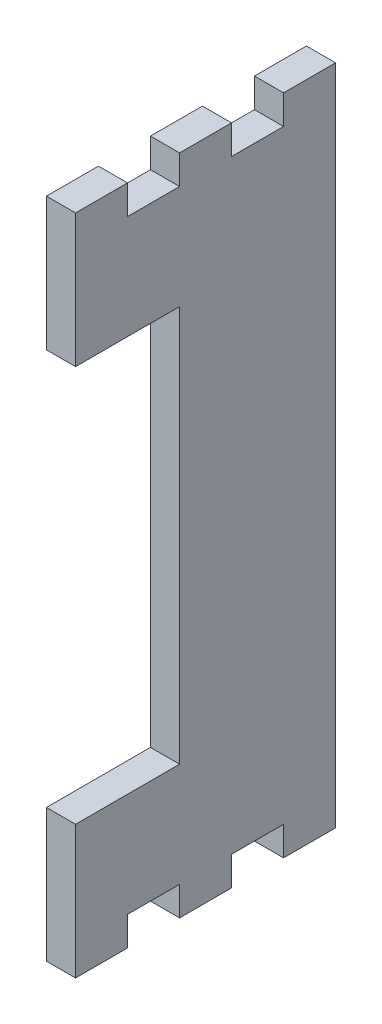
ISO-10303-21;
HEADER;
FILE_DESCRIPTION(('STEP AP214'),'2;1');
FILE_NAME('part.step','',(''),(''),'','','');
FILE_SCHEMA(('AUTOMOTIVE_DESIGN { 1 0 10303 214 1 1 1 1 }'));
ENDSEC;
DATA;
#1=APPLICATION_CONTEXT('core data for automotive mechanical design processes');
#2=APPLICATION_PROTOCOL_DEFINITION('international standard','automotive_design',2000,#1);
#3=PRODUCT_CONTEXT('',#1,'mechanical');
#4=PRODUCT('Part','Part','',(#3));
#5=PRODUCT_RELATED_PRODUCT_CATEGORY('part','',(#4));
#6=PRODUCT_DEFINITION_FORMATION('','',#4);
#7=PRODUCT_DEFINITION_CONTEXT('part definition',#1,'design');
#8=PRODUCT_DEFINITION('design','',#6,#7);
#9=PRODUCT_DEFINITION_SHAPE('','',#8);
#10=(LENGTH_UNIT() NAMED_UNIT(*) SI_UNIT(.MILLI.,.METRE.));
#11=(NAMED_UNIT(*) PLANE_ANGLE_UNIT() SI_UNIT($,.RADIAN.));
#12=(NAMED_UNIT(*) SI_UNIT($,.STERADIAN.) SOLID_ANGLE_UNIT());
#13=UNCERTAINTY_MEASURE_WITH_UNIT(LENGTH_MEASURE(1.E-05),#10,'distance_accuracy_value','');
#14=(GEOMETRIC_REPRESENTATION_CONTEXT(3) GLOBAL_UNCERTAINTY_ASSIGNED_CONTEXT((#13)) GLOBAL_UNIT_ASSIGNED_CONTEXT((#10,
#11,#12)) REPRESENTATION_CONTEXT('',''));
#15=CARTESIAN_POINT('',(0.,0.,0.));
#16=DIRECTION('',(0.,0.,1.));
#17=DIRECTION('',(1.,0.,0.));
#18=AXIS2_PLACEMENT_3D('',#15,#16,#17);
#19=CARTESIAN_POINT('',(-255.694312824647,129.093154424768,-151.110405002896));
#20=DIRECTION('',(0.,0.,1.));
#21=DIRECTION('',(1.,0.,0.));
#22=AXIS2_PLACEMENT_3D('',#19,#20,#21);
#23=PLANE('',#22);
#24=DIRECTION('',(0.,1.,0.));
#25=VECTOR('',#24,1.);
#26=CARTESIAN_POINT('',(-261.294312824647,129.093154424768,-151.110405002896));
#27=LINE('',#26,#25);
#28=CARTESIAN_POINT('',(-261.294312824647,109.093154424768,-151.110405002896));
#29=VERTEX_POINT('',#28);
#30=CARTESIAN_POINT('',(-261.294312824647,134.693154424768,-151.110405002896));
#31=VERTEX_POINT('',#30);
#32=EDGE_CURVE('E293',#29,#31,#27,.T.);
#33=ORIENTED_EDGE('',*,*,#32,.F.);
#34=DIRECTION('',(-1.,0.,0.));
#35=VECTOR('',#34,1.);
#36=CARTESIAN_POINT('',(-255.694312824647,109.093154424768,-151.110405002896));
#37=LINE('',#36,#35);
#38=CARTESIAN_POINT('',(-255.694312824647,109.093154424768,-151.110405002896));
#39=VERTEX_POINT('',#38);
#40=EDGE_CURVE('E11',#39,#29,#37,.T.);
#41=ORIENTED_EDGE('',*,*,#40,.F.);
#42=DIRECTION('',(0.,1.,0.));
#43=VECTOR('',#42,1.);
#44=CARTESIAN_POINT('',(-255.694312824647,129.093154424768,-151.110405002896));
#45=LINE('',#44,#43);
#46=CARTESIAN_POINT('',(-255.694312824647,134.693154424768,-151.110405002896));
#47=VERTEX_POINT('',#46);
#48=EDGE_CURVE('E52',#39,#47,#45,.T.);
#49=ORIENTED_EDGE('',*,*,#48,.T.);
#50=DIRECTION('',(-1.,0.,0.));
#51=VECTOR('',#50,1.);
#52=CARTESIAN_POINT('',(-255.694312824647,134.693154424768,-151.110405002896));
#53=LINE('',#52,#51);
#54=EDGE_CURVE('E37',#47,#31,#53,.T.);
#55=ORIENTED_EDGE('',*,*,#54,.T.);
#56=EDGE_LOOP('',(#33,#41,#49,#55));
#57=FACE_BOUND('',#56,.T.);
#58=ADVANCED_FACE('F33',(#57),#23,.T.);
#59=CARTESIAN_POINT('',(-255.694312824647,109.093154424768,-151.110405002896));
#60=DIRECTION('',(0.,-1.,0.));
#61=DIRECTION('',(0.,0.,-1.));
#62=AXIS2_PLACEMENT_3D('',#59,#60,#61);
#63=PLANE('',#62);
#64=DIRECTION('',(0.,0.,1.));
#65=VECTOR('',#64,1.);
#66=CARTESIAN_POINT('',(-261.294312824647,109.093154424768,-151.110405002896));
#67=LINE('',#66,#65);
#68=CARTESIAN_POINT('',(-261.294312824647,109.093154424768,-171.110405002896));
#69=VERTEX_POINT('',#68);
#70=EDGE_CURVE('E291',#69,#29,#67,.T.);
#71=ORIENTED_EDGE('',*,*,#70,.F.);
#72=DIRECTION('',(-1.,0.,0.));
#73=VECTOR('',#72,1.);
#74=CARTESIAN_POINT('',(-255.694312824647,109.093154424768,-171.110405002896));
#75=LINE('',#74,#73);
#76=CARTESIAN_POINT('',(-255.694312824647,109.093154424768,-171.110405002896));
#77=VERTEX_POINT('',#76);
#78=EDGE_CURVE('E43',#77,#69,#75,.T.);
#79=ORIENTED_EDGE('',*,*,#78,.F.);
#80=DIRECTION('',(0.,0.,1.));
#81=VECTOR('',#80,1.);
#82=CARTESIAN_POINT('',(-255.694312824647,109.093154424768,-151.110405002896));
#83=LINE('',#82,#81);
#84=EDGE_CURVE('E217',#77,#39,#83,.T.);
#85=ORIENTED_EDGE('',*,*,#84,.T.);
#86=ORIENTED_EDGE('',*,*,#40,.T.);
#87=EDGE_LOOP('',(#71,#79,#85,#86));
#88=FACE_BOUND('',#87,.T.);
#89=ADVANCED_FACE('F340',(#88),#63,.T.);
#90=CARTESIAN_POINT('',(-255.694312824647,32.8931544247676,-171.110405002896));
#91=DIRECTION('',(0.,0.,1.));
#92=DIRECTION('',(1.,0.,0.));
#93=AXIS2_PLACEMENT_3D('',#90,#91,#92);
#94=PLANE('',#93);
#95=DIRECTION('',(0.,1.,0.));
#96=VECTOR('',#95,1.);
#97=CARTESIAN_POINT('',(-261.294312824647,32.8931544247676,-171.110405002896));
#98=LINE('',#97,#96);
#99=CARTESIAN_POINT('',(-261.294312824647,32.8931544247676,-171.110405002896));
#100=VERTEX_POINT('',#99);
#101=EDGE_CURVE('E206',#100,#69,#98,.T.);
#102=ORIENTED_EDGE('',*,*,#101,.F.);
#103=DIRECTION('',(-1.,0.,0.));
#104=VECTOR('',#103,1.);
#105=CARTESIAN_POINT('',(-255.694312824647,32.8931544247676,-171.110405002896));
#106=LINE('',#105,#104);
#107=CARTESIAN_POINT('',(-255.694312824647,32.8931544247676,-171.110405002896));
#108=VERTEX_POINT('',#107);
#109=EDGE_CURVE('E201',#108,#100,#106,.T.);
#110=ORIENTED_EDGE('',*,*,#109,.F.);
#111=DIRECTION('',(0.,1.,0.));
#112=VECTOR('',#111,1.);
#113=CARTESIAN_POINT('',(-255.694312824647,32.8931544247676,-171.110405002896));
#114=LINE('',#113,#112);
#115=EDGE_CURVE('E204',#108,#77,#114,.T.);
#116=ORIENTED_EDGE('',*,*,#115,.T.);
#117=ORIENTED_EDGE('',*,*,#78,.T.);
#118=EDGE_LOOP('',(#102,#110,#116,#117));
#119=FACE_BOUND('',#118,.T.);
#120=ADVANCED_FACE('F203',(#119),#94,.T.);
#121=CARTESIAN_POINT('',(-255.694312824647,32.8931544247676,-151.110405002896));
#122=DIRECTION('',(0.,1.,0.));
#123=DIRECTION('',(0.,0.,1.));
#124=AXIS2_PLACEMENT_3D('',#121,#122,#123);
#125=PLANE('',#124);
#126=DIRECTION('',(0.,0.,-1.));
#127=VECTOR('',#126,1.);
#128=CARTESIAN_POINT('',(-261.294312824647,32.8931544247676,-151.110405002896));
#129=LINE('',#128,#127);
#130=CARTESIAN_POINT('',(-261.294312824647,32.8931544247676,-151.110405002896));
#131=VERTEX_POINT('',#130);
#132=EDGE_CURVE('E288',#131,#100,#129,.T.);
#133=ORIENTED_EDGE('',*,*,#132,.F.);
#134=DIRECTION('',(-1.,0.,0.));
#135=VECTOR('',#134,1.);
#136=CARTESIAN_POINT('',(-255.694312824647,32.8931544247676,-151.110405002896));
#137=LINE('',#136,#135);
#138=CARTESIAN_POINT('',(-255.694312824647,32.8931544247676,-151.110405002896));
#139=VERTEX_POINT('',#138);
#140=EDGE_CURVE('E211',#139,#131,#137,.T.);
#141=ORIENTED_EDGE('',*,*,#140,.F.);
#142=DIRECTION('',(0.,0.,-1.));
#143=VECTOR('',#142,1.);
#144=CARTESIAN_POINT('',(-255.694312824647,32.8931544247676,-151.110405002896));
#145=LINE('',#144,#143);
#146=EDGE_CURVE('E216',#139,#108,#145,.T.);
#147=ORIENTED_EDGE('',*,*,#146,.T.);
#148=ORIENTED_EDGE('',*,*,#109,.T.);
#149=EDGE_LOOP('',(#133,#141,#147,#148));
#150=FACE_BOUND('',#149,.T.);
#151=ADVANCED_FACE('F220',(#150),#125,.T.);
#152=CARTESIAN_POINT('',(-255.694312824647,32.8931544247676,-151.110405002896));
#153=DIRECTION('',(0.,0.,1.));
#154=DIRECTION('',(1.,0.,0.));
#155=AXIS2_PLACEMENT_3D('',#152,#153,#154);
#156=PLANE('',#155);
#157=DIRECTION('',(0.,1.,0.));
#158=VECTOR('',#157,1.);
#159=CARTESIAN_POINT('',(-261.294312824647,32.8931544247676,-151.110405002896));
#160=LINE('',#159,#158);
#161=CARTESIAN_POINT('',(-261.294312824647,7.29315442476763,-151.110405002896));
#162=VERTEX_POINT('',#161);
#163=EDGE_CURVE('E285',#162,#131,#160,.T.);
#164=ORIENTED_EDGE('',*,*,#163,.F.);
#165=DIRECTION('',(-1.,0.,0.));
#166=VECTOR('',#165,1.);
#167=CARTESIAN_POINT('',(-255.694312824647,7.29315442476763,-151.110405002896));
#168=LINE('',#167,#166);
#169=CARTESIAN_POINT('',(-255.694312824647,7.29315442476763,-151.110405002896));
#170=VERTEX_POINT('',#169);
#171=EDGE_CURVE('E297',#170,#162,#168,.T.);
#172=ORIENTED_EDGE('',*,*,#171,.F.);
#173=DIRECTION('',(0.,1.,0.));
#174=VECTOR('',#173,1.);
#175=CARTESIAN_POINT('',(-255.694312824647,7.29315442476763,-151.110405002896));
#176=LINE('',#175,#174);
#177=EDGE_CURVE('E221',#170,#139,#176,.T.);
#178=ORIENTED_EDGE('',*,*,#177,.T.);
#179=ORIENTED_EDGE('',*,*,#140,.T.);
#180=EDGE_LOOP('',(#164,#172,#178,#179));
#181=FACE_BOUND('',#180,.T.);
#182=ADVANCED_FACE('F353',(#181),#156,.T.);
#183=CARTESIAN_POINT('',(-255.694312824647,7.29315442476763,-161.110405002896));
#184=DIRECTION('',(0.,-1.,0.));
#185=DIRECTION('',(0.,0.,-1.));
#186=AXIS2_PLACEMENT_3D('',#183,#184,#185);
#187=PLANE('',#186);
#188=DIRECTION('',(0.,0.,1.));
#189=VECTOR('',#188,1.);
#190=CARTESIAN_POINT('',(-261.294312824647,7.29315442476763,-161.110405002896));
#191=LINE('',#190,#189);
#192=CARTESIAN_POINT('',(-261.294312824647,7.29315442476763,-161.110405002896));
#193=VERTEX_POINT('',#192);
#194=EDGE_CURVE('E282',#193,#162,#191,.T.);
#195=ORIENTED_EDGE('',*,*,#194,.F.);
#196=DIRECTION('',(-1.,0.,0.));
#197=VECTOR('',#196,1.);
#198=CARTESIAN_POINT('',(-255.694312824647,7.29315442476763,-161.110405002896));
#199=LINE('',#198,#197);
#200=CARTESIAN_POINT('',(-255.694312824647,7.29315442476763,-161.110405002896));
#201=VERTEX_POINT('',#200);
#202=EDGE_CURVE('E300',#201,#193,#199,.T.);
#203=ORIENTED_EDGE('',*,*,#202,.F.);
#204=DIRECTION('',(0.,0.,1.));
#205=VECTOR('',#204,1.);
#206=CARTESIAN_POINT('',(-255.694312824647,7.29315442476763,-161.110405002896));
#207=LINE('',#206,#205);
#208=EDGE_CURVE('E223',#201,#170,#207,.T.);
#209=ORIENTED_EDGE('',*,*,#208,.T.);
#210=ORIENTED_EDGE('',*,*,#171,.T.);
#211=EDGE_LOOP('',(#195,#203,#209,#210));
#212=FACE_BOUND('',#211,.T.);
#213=ADVANCED_FACE('F356',(#212),#187,.T.);
#214=CARTESIAN_POINT('',(-255.694312824647,12.8931544247676,-161.110405002896));
#215=DIRECTION('',(0.,0.,-1.));
#216=DIRECTION('',(-1.,0.,0.));
#217=AXIS2_PLACEMENT_3D('',#214,#215,#216);
#218=PLANE('',#217);
#219=DIRECTION('',(0.,-1.,0.));
#220=VECTOR('',#219,1.);
#221=CARTESIAN_POINT('',(-261.294312824647,12.8931544247676,-161.110405002896));
#222=LINE('',#221,#220);
#223=CARTESIAN_POINT('',(-261.294312824647,12.8931544247676,-161.110405002896));
#224=VERTEX_POINT('',#223);
#225=EDGE_CURVE('E279',#224,#193,#222,.T.);
#226=ORIENTED_EDGE('',*,*,#225,.F.);
#227=DIRECTION('',(-1.,0.,0.));
#228=VECTOR('',#227,1.);
#229=CARTESIAN_POINT('',(-255.694312824647,12.8931544247676,-161.110405002896));
#230=LINE('',#229,#228);
#231=CARTESIAN_POINT('',(-255.694312824647,12.8931544247676,-161.110405002896));
#232=VERTEX_POINT('',#231);
#233=EDGE_CURVE('E302',#232,#224,#230,.T.);
#234=ORIENTED_EDGE('',*,*,#233,.F.);
#235=DIRECTION('',(0.,-1.,0.));
#236=VECTOR('',#235,1.);
#237=CARTESIAN_POINT('',(-255.694312824647,12.8931544247676,-161.110405002896));
#238=LINE('',#237,#236);
#239=EDGE_CURVE('E493',#232,#201,#238,.T.);
#240=ORIENTED_EDGE('',*,*,#239,.T.);
#241=ORIENTED_EDGE('',*,*,#202,.T.);
#242=EDGE_LOOP('',(#226,#234,#240,#241));
#243=FACE_BOUND('',#242,.T.);
#244=ADVANCED_FACE('F360',(#243),#218,.T.);
#245=CARTESIAN_POINT('',(-255.694312824647,12.8931544247676,-161.110405002896));
#246=DIRECTION('',(0.,-1.,0.));
#247=DIRECTION('',(0.,0.,-1.));
#248=AXIS2_PLACEMENT_3D('',#245,#246,#247);
#249=PLANE('',#248);
#250=DIRECTION('',(0.,0.,1.));
#251=VECTOR('',#250,1.);
#252=CARTESIAN_POINT('',(-261.294312824647,12.8931544247676,-161.110405002896));
#253=LINE('',#252,#251);
#254=CARTESIAN_POINT('',(-261.294312824647,12.8931544247676,-171.110405002896));
#255=VERTEX_POINT('',#254);
#256=EDGE_CURVE('E276',#255,#224,#253,.T.);
#257=ORIENTED_EDGE('',*,*,#256,.F.);
#258=DIRECTION('',(-1.,0.,0.));
#259=VECTOR('',#258,1.);
#260=CARTESIAN_POINT('',(-255.694312824647,12.8931544247676,-171.110405002896));
#261=LINE('',#260,#259);
#262=CARTESIAN_POINT('',(-255.694312824647,12.8931544247676,-171.110405002896));
#263=VERTEX_POINT('',#262);
#264=EDGE_CURVE('E304',#263,#255,#261,.T.);
#265=ORIENTED_EDGE('',*,*,#264,.F.);
#266=DIRECTION('',(0.,0.,1.));
#267=VECTOR('',#266,1.);
#268=CARTESIAN_POINT('',(-255.694312824647,12.8931544247676,-161.110405002896));
#269=LINE('',#268,#267);
#270=EDGE_CURVE('E487',#263,#232,#269,.T.);
#271=ORIENTED_EDGE('',*,*,#270,.T.);
#272=ORIENTED_EDGE('',*,*,#233,.T.);
#273=EDGE_LOOP('',(#257,#265,#271,#272));
#274=FACE_BOUND('',#273,.T.);
#275=ADVANCED_FACE('F364',(#274),#249,.T.);
#276=CARTESIAN_POINT('',(-255.694312824647,7.29315442476763,-171.110405002896));
#277=DIRECTION('',(0.,0.,1.));
#278=DIRECTION('',(1.,0.,0.));
#279=AXIS2_PLACEMENT_3D('',#276,#277,#278);
#280=PLANE('',#279);
#281=DIRECTION('',(0.,1.,0.));
#282=VECTOR('',#281,1.);
#283=CARTESIAN_POINT('',(-261.294312824647,7.29315442476763,-171.110405002896));
#284=LINE('',#283,#282);
#285=CARTESIAN_POINT('',(-261.294312824647,7.29315442476763,-171.110405002896));
#286=VERTEX_POINT('',#285);
#287=EDGE_CURVE('E273',#286,#255,#284,.T.);
#288=ORIENTED_EDGE('',*,*,#287,.F.);
#289=DIRECTION('',(-1.,0.,0.));
#290=VECTOR('',#289,1.);
#291=CARTESIAN_POINT('',(-255.694312824647,7.29315442476763,-171.110405002896));
#292=LINE('',#291,#290);
#293=CARTESIAN_POINT('',(-255.694312824647,7.29315442476763,-171.110405002896));
#294=VERTEX_POINT('',#293);
#295=EDGE_CURVE('E306',#294,#286,#292,.T.);
#296=ORIENTED_EDGE('',*,*,#295,.F.);
#297=DIRECTION('',(0.,1.,0.));
#298=VECTOR('',#297,1.);
#299=CARTESIAN_POINT('',(-255.694312824647,7.29315442476763,-171.110405002896));
#300=LINE('',#299,#298);
#301=EDGE_CURVE('E483',#294,#263,#300,.T.);
#302=ORIENTED_EDGE('',*,*,#301,.T.);
#303=ORIENTED_EDGE('',*,*,#264,.T.);
#304=EDGE_LOOP('',(#288,#296,#302,#303));
#305=FACE_BOUND('',#304,.T.);
#306=ADVANCED_FACE('F368',(#305),#280,.T.);
#307=CARTESIAN_POINT('',(-255.694312824647,7.29315442476763,-181.110405002896));
#308=DIRECTION('',(0.,-1.,0.));
#309=DIRECTION('',(0.,0.,-1.));
#310=AXIS2_PLACEMENT_3D('',#307,#308,#309);
#311=PLANE('',#310);
#312=DIRECTION('',(0.,0.,1.));
#313=VECTOR('',#312,1.);
#314=CARTESIAN_POINT('',(-261.294312824647,7.29315442476763,-181.110405002896));
#315=LINE('',#314,#313);
#316=CARTESIAN_POINT('',(-261.294312824647,7.29315442476763,-181.110405002896));
#317=VERTEX_POINT('',#316);
#318=EDGE_CURVE('E270',#317,#286,#315,.T.);
#319=ORIENTED_EDGE('',*,*,#318,.F.);
#320=DIRECTION('',(-1.,0.,0.));
#321=VECTOR('',#320,1.);
#322=CARTESIAN_POINT('',(-255.694312824647,7.29315442476763,-181.110405002896));
#323=LINE('',#322,#321);
#324=CARTESIAN_POINT('',(-255.694312824647,7.29315442476763,-181.110405002896));
#325=VERTEX_POINT('',#324);
#326=EDGE_CURVE('E308',#325,#317,#323,.T.);
#327=ORIENTED_EDGE('',*,*,#326,.F.);
#328=DIRECTION('',(0.,0.,1.));
#329=VECTOR('',#328,1.);
#330=CARTESIAN_POINT('',(-255.694312824647,7.29315442476763,-181.110405002896));
#331=LINE('',#330,#329);
#332=EDGE_CURVE('E498',#325,#294,#331,.T.);
#333=ORIENTED_EDGE('',*,*,#332,.T.);
#334=ORIENTED_EDGE('',*,*,#295,.T.);
#335=EDGE_LOOP('',(#319,#327,#333,#334));
#336=FACE_BOUND('',#335,.T.);
#337=ADVANCED_FACE('F372',(#336),#311,.T.);
#338=CARTESIAN_POINT('',(-255.694312824647,12.8931544247676,-181.110405002896));
#339=DIRECTION('',(0.,0.,-1.));
#340=DIRECTION('',(-1.,0.,0.));
#341=AXIS2_PLACEMENT_3D('',#338,#339,#340);
#342=PLANE('',#341);
#343=DIRECTION('',(0.,-1.,0.));
#344=VECTOR('',#343,1.);
#345=CARTESIAN_POINT('',(-261.294312824647,12.8931544247676,-181.110405002896));
#346=LINE('',#345,#344);
#347=CARTESIAN_POINT('',(-261.294312824647,12.8931544247676,-181.110405002896));
#348=VERTEX_POINT('',#347);
#349=EDGE_CURVE('E267',#348,#317,#346,.T.);
#350=ORIENTED_EDGE('',*,*,#349,.F.);
#351=DIRECTION('',(-1.,0.,0.));
#352=VECTOR('',#351,1.);
#353=CARTESIAN_POINT('',(-255.694312824647,12.8931544247676,-181.110405002896));
#354=LINE('',#353,#352);
#355=CARTESIAN_POINT('',(-255.694312824647,12.8931544247676,-181.110405002896));
#356=VERTEX_POINT('',#355);
#357=EDGE_CURVE('E310',#356,#348,#354,.T.);
#358=ORIENTED_EDGE('',*,*,#357,.F.);
#359=DIRECTION('',(0.,-1.,0.));
#360=VECTOR('',#359,1.);
#361=CARTESIAN_POINT('',(-255.694312824647,12.8931544247676,-181.110405002896));
#362=LINE('',#361,#360);
#363=EDGE_CURVE('E476',#356,#325,#362,.T.);
#364=ORIENTED_EDGE('',*,*,#363,.T.);
#365=ORIENTED_EDGE('',*,*,#326,.T.);
#366=EDGE_LOOP('',(#350,#358,#364,#365));
#367=FACE_BOUND('',#366,.T.);
#368=ADVANCED_FACE('F376',(#367),#342,.T.);
#369=CARTESIAN_POINT('',(-255.694312824647,12.8931544247676,-181.110405002896));
#370=DIRECTION('',(0.,-1.,0.));
#371=DIRECTION('',(0.,0.,-1.));
#372=AXIS2_PLACEMENT_3D('',#369,#370,#371);
#373=PLANE('',#372);
#374=DIRECTION('',(0.,0.,1.));
#375=VECTOR('',#374,1.);
#376=CARTESIAN_POINT('',(-261.294312824647,12.8931544247676,-181.110405002896));
#377=LINE('',#376,#375);
#378=CARTESIAN_POINT('',(-261.294312824647,12.8931544247676,-191.110405002896));
#379=VERTEX_POINT('',#378);
#380=EDGE_CURVE('E264',#379,#348,#377,.T.);
#381=ORIENTED_EDGE('',*,*,#380,.F.);
#382=DIRECTION('',(-1.,0.,0.));
#383=VECTOR('',#382,1.);
#384=CARTESIAN_POINT('',(-255.694312824647,12.8931544247676,-191.110405002896));
#385=LINE('',#384,#383);
#386=CARTESIAN_POINT('',(-255.694312824647,12.8931544247676,-191.110405002896));
#387=VERTEX_POINT('',#386);
#388=EDGE_CURVE('E312',#387,#379,#385,.T.);
#389=ORIENTED_EDGE('',*,*,#388,.F.);
#390=DIRECTION('',(0.,0.,1.));
#391=VECTOR('',#390,1.);
#392=CARTESIAN_POINT('',(-255.694312824647,12.8931544247676,-181.110405002896));
#393=LINE('',#392,#391);
#394=EDGE_CURVE('E472',#387,#356,#393,.T.);
#395=ORIENTED_EDGE('',*,*,#394,.T.);
#396=ORIENTED_EDGE('',*,*,#357,.T.);
#397=EDGE_LOOP('',(#381,#389,#395,#396));
#398=FACE_BOUND('',#397,.T.);
#399=ADVANCED_FACE('F380',(#398),#373,.T.);
#400=CARTESIAN_POINT('',(-255.694312824647,7.29315442476763,-191.110405002896));
#401=DIRECTION('',(0.,0.,1.));
#402=DIRECTION('',(1.,0.,0.));
#403=AXIS2_PLACEMENT_3D('',#400,#401,#402);
#404=PLANE('',#403);
#405=DIRECTION('',(0.,1.,0.));
#406=VECTOR('',#405,1.);
#407=CARTESIAN_POINT('',(-261.294312824647,7.29315442476763,-191.110405002896));
#408=LINE('',#407,#406);
#409=CARTESIAN_POINT('',(-261.294312824647,7.29315442476763,-191.110405002896));
#410=VERTEX_POINT('',#409);
#411=EDGE_CURVE('E261',#410,#379,#408,.T.);
#412=ORIENTED_EDGE('',*,*,#411,.F.);
#413=DIRECTION('',(-1.,0.,0.));
#414=VECTOR('',#413,1.);
#415=CARTESIAN_POINT('',(-255.694312824647,7.29315442476763,-191.110405002896));
#416=LINE('',#415,#414);
#417=CARTESIAN_POINT('',(-255.694312824647,7.29315442476763,-191.110405002896));
#418=VERTEX_POINT('',#417);
#419=EDGE_CURVE('E314',#418,#410,#416,.T.);
#420=ORIENTED_EDGE('',*,*,#419,.F.);
#421=DIRECTION('',(0.,1.,0.));
#422=VECTOR('',#421,1.);
#423=CARTESIAN_POINT('',(-255.694312824647,7.29315442476763,-191.110405002896));
#424=LINE('',#423,#422);
#425=EDGE_CURVE('E502',#418,#387,#424,.T.);
#426=ORIENTED_EDGE('',*,*,#425,.T.);
#427=ORIENTED_EDGE('',*,*,#388,.T.);
#428=EDGE_LOOP('',(#412,#420,#426,#427));
#429=FACE_BOUND('',#428,.T.);
#430=ADVANCED_FACE('F384',(#429),#404,.T.);
#431=CARTESIAN_POINT('',(-255.694312824647,7.29315442476763,-201.110405002896));
#432=DIRECTION('',(0.,-1.,0.));
#433=DIRECTION('',(0.,0.,-1.));
#434=AXIS2_PLACEMENT_3D('',#431,#432,#433);
#435=PLANE('',#434);
#436=DIRECTION('',(0.,0.,1.));
#437=VECTOR('',#436,1.);
#438=CARTESIAN_POINT('',(-261.294312824647,7.29315442476763,-201.110405002896));
#439=LINE('',#438,#437);
#440=CARTESIAN_POINT('',(-261.294312824647,7.29315442476763,-201.110405002896));
#441=VERTEX_POINT('',#440);
#442=EDGE_CURVE('E258',#441,#410,#439,.T.);
#443=ORIENTED_EDGE('',*,*,#442,.F.);
#444=DIRECTION('',(-1.,0.,0.));
#445=VECTOR('',#444,1.);
#446=CARTESIAN_POINT('',(-255.694312824647,7.29315442476763,-201.110405002896));
#447=LINE('',#446,#445);
#448=CARTESIAN_POINT('',(-255.694312824647,7.29315442476763,-201.110405002896));
#449=VERTEX_POINT('',#448);
#450=EDGE_CURVE('E316',#449,#441,#447,.T.);
#451=ORIENTED_EDGE('',*,*,#450,.F.);
#452=DIRECTION('',(0.,0.,1.));
#453=VECTOR('',#452,1.);
#454=CARTESIAN_POINT('',(-255.694312824647,7.29315442476763,-201.110405002896));
#455=LINE('',#454,#453);
#456=EDGE_CURVE('E465',#449,#418,#455,.T.);
#457=ORIENTED_EDGE('',*,*,#456,.T.);
#458=ORIENTED_EDGE('',*,*,#419,.T.);
#459=EDGE_LOOP('',(#443,#451,#457,#458));
#460=FACE_BOUND('',#459,.T.);
#461=ADVANCED_FACE('F388',(#460),#435,.T.);
#462=CARTESIAN_POINT('',(-255.694312824647,12.8931544247676,-201.110405002896));
#463=DIRECTION('',(0.,0.,-1.));
#464=DIRECTION('',(-1.,0.,0.));
#465=AXIS2_PLACEMENT_3D('',#462,#463,#464);
#466=PLANE('',#465);
#467=DIRECTION('',(0.,-1.,0.));
#468=VECTOR('',#467,1.);
#469=CARTESIAN_POINT('',(-261.294312824647,12.8931544247676,-201.110405002896));
#470=LINE('',#469,#468);
#471=CARTESIAN_POINT('',(-261.294312824647,134.693154424768,-201.110405002896));
#472=VERTEX_POINT('',#471);
#473=EDGE_CURVE('E255',#472,#441,#470,.T.);
#474=ORIENTED_EDGE('',*,*,#473,.F.);
#475=DIRECTION('',(-1.,0.,0.));
#476=VECTOR('',#475,1.);
#477=CARTESIAN_POINT('',(-255.694312824647,134.693154424768,-201.110405002896));
#478=LINE('',#477,#476);
#479=CARTESIAN_POINT('',(-255.694312824647,134.693154424768,-201.110405002896));
#480=VERTEX_POINT('',#479);
#481=EDGE_CURVE('E318',#480,#472,#478,.T.);
#482=ORIENTED_EDGE('',*,*,#481,.F.);
#483=DIRECTION('',(0.,-1.,0.));
#484=VECTOR('',#483,1.);
#485=CARTESIAN_POINT('',(-255.694312824647,134.693154424768,-201.110405002896));
#486=LINE('',#485,#484);
#487=EDGE_CURVE('E461',#480,#449,#486,.T.);
#488=ORIENTED_EDGE('',*,*,#487,.T.);
#489=ORIENTED_EDGE('',*,*,#450,.T.);
#490=EDGE_LOOP('',(#474,#482,#488,#489));
#491=FACE_BOUND('',#490,.T.);
#492=ADVANCED_FACE('F392',(#491),#466,.T.);
#493=CARTESIAN_POINT('',(-255.694312824647,134.693154424768,-191.110405002896));
#494=DIRECTION('',(0.,1.,0.));
#495=DIRECTION('',(0.,0.,1.));
#496=AXIS2_PLACEMENT_3D('',#493,#494,#495);
#497=PLANE('',#496);
#498=DIRECTION('',(0.,0.,-1.));
#499=VECTOR('',#498,1.);
#500=CARTESIAN_POINT('',(-261.294312824647,134.693154424768,-191.110405002896));
#501=LINE('',#500,#499);
#502=CARTESIAN_POINT('',(-261.294312824647,134.693154424768,-191.110405002896));
#503=VERTEX_POINT('',#502);
#504=EDGE_CURVE('E252',#503,#472,#501,.T.);
#505=ORIENTED_EDGE('',*,*,#504,.F.);
#506=DIRECTION('',(-1.,0.,0.));
#507=VECTOR('',#506,1.);
#508=CARTESIAN_POINT('',(-255.694312824647,134.693154424768,-191.110405002896));
#509=LINE('',#508,#507);
#510=CARTESIAN_POINT('',(-255.694312824647,134.693154424768,-191.110405002896));
#511=VERTEX_POINT('',#510);
#512=EDGE_CURVE('E321',#511,#503,#509,.T.);
#513=ORIENTED_EDGE('',*,*,#512,.F.);
#514=DIRECTION('',(0.,0.,-1.));
#515=VECTOR('',#514,1.);
#516=CARTESIAN_POINT('',(-255.694312824647,134.693154424768,-191.110405002896));
#517=LINE('',#516,#515);
#518=EDGE_CURVE('E506',#511,#480,#517,.T.);
#519=ORIENTED_EDGE('',*,*,#518,.T.);
#520=ORIENTED_EDGE('',*,*,#481,.T.);
#521=EDGE_LOOP('',(#505,#513,#519,#520));
#522=FACE_BOUND('',#521,.T.);
#523=ADVANCED_FACE('F396',(#522),#497,.T.);
#524=CARTESIAN_POINT('',(-255.694312824647,129.093154424768,-191.110405002896));
#525=DIRECTION('',(0.,0.,1.));
#526=DIRECTION('',(1.,0.,0.));
#527=AXIS2_PLACEMENT_3D('',#524,#525,#526);
#528=PLANE('',#527);
#529=DIRECTION('',(0.,1.,0.));
#530=VECTOR('',#529,1.);
#531=CARTESIAN_POINT('',(-261.294312824647,129.093154424768,-191.110405002896));
#532=LINE('',#531,#530);
#533=CARTESIAN_POINT('',(-261.294312824647,129.093154424768,-191.110405002896));
#534=VERTEX_POINT('',#533);
#535=EDGE_CURVE('E249',#534,#503,#532,.T.);
#536=ORIENTED_EDGE('',*,*,#535,.F.);
#537=DIRECTION('',(-1.,0.,0.));
#538=VECTOR('',#537,1.);
#539=CARTESIAN_POINT('',(-255.694312824647,129.093154424768,-191.110405002896));
#540=LINE('',#539,#538);
#541=CARTESIAN_POINT('',(-255.694312824647,129.093154424768,-191.110405002896));
#542=VERTEX_POINT('',#541);
#543=EDGE_CURVE('E323',#542,#534,#540,.T.);
#544=ORIENTED_EDGE('',*,*,#543,.F.);
#545=DIRECTION('',(0.,1.,0.));
#546=VECTOR('',#545,1.);
#547=CARTESIAN_POINT('',(-255.694312824647,129.093154424768,-191.110405002896));
#548=LINE('',#547,#546);
#549=EDGE_CURVE('E455',#542,#511,#548,.T.);
#550=ORIENTED_EDGE('',*,*,#549,.T.);
#551=ORIENTED_EDGE('',*,*,#512,.T.);
#552=EDGE_LOOP('',(#536,#544,#550,#551));
#553=FACE_BOUND('',#552,.T.);
#554=ADVANCED_FACE('F400',(#553),#528,.T.);
#555=CARTESIAN_POINT('',(-255.694312824647,129.093154424768,-181.110405002896));
#556=DIRECTION('',(0.,1.,0.));
#557=DIRECTION('',(0.,0.,1.));
#558=AXIS2_PLACEMENT_3D('',#555,#556,#557);
#559=PLANE('',#558);
#560=DIRECTION('',(0.,0.,-1.));
#561=VECTOR('',#560,1.);
#562=CARTESIAN_POINT('',(-261.294312824647,129.093154424768,-181.110405002896));
#563=LINE('',#562,#561);
#564=CARTESIAN_POINT('',(-261.294312824647,129.093154424768,-181.110405002896));
#565=VERTEX_POINT('',#564);
#566=EDGE_CURVE('E246',#565,#534,#563,.T.);
#567=ORIENTED_EDGE('',*,*,#566,.F.);
#568=DIRECTION('',(-1.,0.,0.));
#569=VECTOR('',#568,1.);
#570=CARTESIAN_POINT('',(-255.694312824647,129.093154424768,-181.110405002896));
#571=LINE('',#570,#569);
#572=CARTESIAN_POINT('',(-255.694312824647,129.093154424768,-181.110405002896));
#573=VERTEX_POINT('',#572);
#574=EDGE_CURVE('E325',#573,#565,#571,.T.);
#575=ORIENTED_EDGE('',*,*,#574,.F.);
#576=DIRECTION('',(0.,0.,-1.));
#577=VECTOR('',#576,1.);
#578=CARTESIAN_POINT('',(-255.694312824647,129.093154424768,-181.110405002896));
#579=LINE('',#578,#577);
#580=EDGE_CURVE('E451',#573,#542,#579,.T.);
#581=ORIENTED_EDGE('',*,*,#580,.T.);
#582=ORIENTED_EDGE('',*,*,#543,.T.);
#583=EDGE_LOOP('',(#567,#575,#581,#582));
#584=FACE_BOUND('',#583,.T.);
#585=ADVANCED_FACE('F404',(#584),#559,.T.);
#586=CARTESIAN_POINT('',(-255.694312824647,134.693154424768,-181.110405002896));
#587=DIRECTION('',(0.,0.,-1.));
#588=DIRECTION('',(-1.,0.,0.));
#589=AXIS2_PLACEMENT_3D('',#586,#587,#588);
#590=PLANE('',#589);
#591=DIRECTION('',(0.,-1.,0.));
#592=VECTOR('',#591,1.);
#593=CARTESIAN_POINT('',(-261.294312824647,134.693154424768,-181.110405002896));
#594=LINE('',#593,#592);
#595=CARTESIAN_POINT('',(-261.294312824647,134.693154424768,-181.110405002896));
#596=VERTEX_POINT('',#595);
#597=EDGE_CURVE('E243',#596,#565,#594,.T.);
#598=ORIENTED_EDGE('',*,*,#597,.F.);
#599=DIRECTION('',(-1.,0.,0.));
#600=VECTOR('',#599,1.);
#601=CARTESIAN_POINT('',(-255.694312824647,134.693154424768,-181.110405002896));
#602=LINE('',#601,#600);
#603=CARTESIAN_POINT('',(-255.694312824647,134.693154424768,-181.110405002896));
#604=VERTEX_POINT('',#603);
#605=EDGE_CURVE('E327',#604,#596,#602,.T.);
#606=ORIENTED_EDGE('',*,*,#605,.F.);
#607=DIRECTION('',(0.,-1.,0.));
#608=VECTOR('',#607,1.);
#609=CARTESIAN_POINT('',(-255.694312824647,134.693154424768,-181.110405002896));
#610=LINE('',#609,#608);
#611=EDGE_CURVE('E510',#604,#573,#610,.T.);
#612=ORIENTED_EDGE('',*,*,#611,.T.);
#613=ORIENTED_EDGE('',*,*,#574,.T.);
#614=EDGE_LOOP('',(#598,#606,#612,#613));
#615=FACE_BOUND('',#614,.T.);
#616=ADVANCED_FACE('F408',(#615),#590,.T.);
#617=CARTESIAN_POINT('',(-255.694312824647,134.693154424768,-171.110405002896));
#618=DIRECTION('',(0.,1.,0.));
#619=DIRECTION('',(0.,0.,1.));
#620=AXIS2_PLACEMENT_3D('',#617,#618,#619);
#621=PLANE('',#620);
#622=DIRECTION('',(0.,0.,-1.));
#623=VECTOR('',#622,1.);
#624=CARTESIAN_POINT('',(-261.294312824647,134.693154424768,-171.110405002896));
#625=LINE('',#624,#623);
#626=CARTESIAN_POINT('',(-261.294312824647,134.693154424768,-171.110405002896));
#627=VERTEX_POINT('',#626);
#628=EDGE_CURVE('E240',#627,#596,#625,.T.);
#629=ORIENTED_EDGE('',*,*,#628,.F.);
#630=DIRECTION('',(-1.,0.,0.));
#631=VECTOR('',#630,1.);
#632=CARTESIAN_POINT('',(-255.694312824647,134.693154424768,-171.110405002896));
#633=LINE('',#632,#631);
#634=CARTESIAN_POINT('',(-255.694312824647,134.693154424768,-171.110405002896));
#635=VERTEX_POINT('',#634);
#636=EDGE_CURVE('E329',#635,#627,#633,.T.);
#637=ORIENTED_EDGE('',*,*,#636,.F.);
#638=DIRECTION('',(0.,0.,-1.));
#639=VECTOR('',#638,1.);
#640=CARTESIAN_POINT('',(-255.694312824647,134.693154424768,-171.110405002896));
#641=LINE('',#640,#639);
#642=EDGE_CURVE('E444',#635,#604,#641,.T.);
#643=ORIENTED_EDGE('',*,*,#642,.T.);
#644=ORIENTED_EDGE('',*,*,#605,.T.);
#645=EDGE_LOOP('',(#629,#637,#643,#644));
#646=FACE_BOUND('',#645,.T.);
#647=ADVANCED_FACE('F412',(#646),#621,.T.);
#648=CARTESIAN_POINT('',(-255.694312824647,129.093154424768,-171.110405002896));
#649=DIRECTION('',(0.,0.,1.));
#650=DIRECTION('',(1.,0.,0.));
#651=AXIS2_PLACEMENT_3D('',#648,#649,#650);
#652=PLANE('',#651);
#653=DIRECTION('',(0.,1.,0.));
#654=VECTOR('',#653,1.);
#655=CARTESIAN_POINT('',(-261.294312824647,129.093154424768,-171.110405002896));
#656=LINE('',#655,#654);
#657=CARTESIAN_POINT('',(-261.294312824647,129.093154424768,-171.110405002896));
#658=VERTEX_POINT('',#657);
#659=EDGE_CURVE('E237',#658,#627,#656,.T.);
#660=ORIENTED_EDGE('',*,*,#659,.F.);
#661=DIRECTION('',(-1.,0.,0.));
#662=VECTOR('',#661,1.);
#663=CARTESIAN_POINT('',(-255.694312824647,129.093154424768,-171.110405002896));
#664=LINE('',#663,#662);
#665=CARTESIAN_POINT('',(-255.694312824647,129.093154424768,-171.110405002896));
#666=VERTEX_POINT('',#665);
#667=EDGE_CURVE('E331',#666,#658,#664,.T.);
#668=ORIENTED_EDGE('',*,*,#667,.F.);
#669=DIRECTION('',(0.,1.,0.));
#670=VECTOR('',#669,1.);
#671=CARTESIAN_POINT('',(-255.694312824647,129.093154424768,-171.110405002896));
#672=LINE('',#671,#670);
#673=EDGE_CURVE('E440',#666,#635,#672,.T.);
#674=ORIENTED_EDGE('',*,*,#673,.T.);
#675=ORIENTED_EDGE('',*,*,#636,.T.);
#676=EDGE_LOOP('',(#660,#668,#674,#675));
#677=FACE_BOUND('',#676,.T.);
#678=ADVANCED_FACE('F416',(#677),#652,.T.);
#679=CARTESIAN_POINT('',(-255.694312824647,129.093154424768,-161.110405002896));
#680=DIRECTION('',(0.,1.,0.));
#681=DIRECTION('',(0.,0.,1.));
#682=AXIS2_PLACEMENT_3D('',#679,#680,#681);
#683=PLANE('',#682);
#684=DIRECTION('',(0.,0.,-1.));
#685=VECTOR('',#684,1.);
#686=CARTESIAN_POINT('',(-261.294312824647,129.093154424768,-161.110405002896));
#687=LINE('',#686,#685);
#688=CARTESIAN_POINT('',(-261.294312824647,129.093154424768,-161.110405002896));
#689=VERTEX_POINT('',#688);
#690=EDGE_CURVE('E234',#689,#658,#687,.T.);
#691=ORIENTED_EDGE('',*,*,#690,.F.);
#692=DIRECTION('',(-1.,0.,0.));
#693=VECTOR('',#692,1.);
#694=CARTESIAN_POINT('',(-255.694312824647,129.093154424768,-161.110405002896));
#695=LINE('',#694,#693);
#696=CARTESIAN_POINT('',(-255.694312824647,129.093154424768,-161.110405002896));
#697=VERTEX_POINT('',#696);
#698=EDGE_CURVE('E333',#697,#689,#695,.T.);
#699=ORIENTED_EDGE('',*,*,#698,.F.);
#700=DIRECTION('',(0.,0.,-1.));
#701=VECTOR('',#700,1.);
#702=CARTESIAN_POINT('',(-255.694312824647,129.093154424768,-161.110405002896));
#703=LINE('',#702,#701);
#704=EDGE_CURVE('E514',#697,#666,#703,.T.);
#705=ORIENTED_EDGE('',*,*,#704,.T.);
#706=ORIENTED_EDGE('',*,*,#667,.T.);
#707=EDGE_LOOP('',(#691,#699,#705,#706));
#708=FACE_BOUND('',#707,.T.);
#709=ADVANCED_FACE('F420',(#708),#683,.T.);
#710=CARTESIAN_POINT('',(-255.694312824647,134.693154424768,-161.110405002896));
#711=DIRECTION('',(0.,0.,-1.));
#712=DIRECTION('',(-1.,0.,0.));
#713=AXIS2_PLACEMENT_3D('',#710,#711,#712);
#714=PLANE('',#713);
#715=DIRECTION('',(0.,-1.,0.));
#716=VECTOR('',#715,1.);
#717=CARTESIAN_POINT('',(-261.294312824647,134.693154424768,-161.110405002896));
#718=LINE('',#717,#716);
#719=CARTESIAN_POINT('',(-261.294312824647,134.693154424768,-161.110405002896));
#720=VERTEX_POINT('',#719);
#721=EDGE_CURVE('E231',#720,#689,#718,.T.);
#722=ORIENTED_EDGE('',*,*,#721,.F.);
#723=DIRECTION('',(-1.,0.,0.));
#724=VECTOR('',#723,1.);
#725=CARTESIAN_POINT('',(-255.694312824647,134.693154424768,-161.110405002896));
#726=LINE('',#725,#724);
#727=CARTESIAN_POINT('',(-255.694312824647,134.693154424768,-161.110405002896));
#728=VERTEX_POINT('',#727);
#729=EDGE_CURVE('E334',#728,#720,#726,.T.);
#730=ORIENTED_EDGE('',*,*,#729,.F.);
#731=DIRECTION('',(0.,-1.,0.));
#732=VECTOR('',#731,1.);
#733=CARTESIAN_POINT('',(-255.694312824647,134.693154424768,-161.110405002896));
#734=LINE('',#733,#732);
#735=EDGE_CURVE('E433',#728,#697,#734,.T.);
#736=ORIENTED_EDGE('',*,*,#735,.T.);
#737=ORIENTED_EDGE('',*,*,#698,.T.);
#738=EDGE_LOOP('',(#722,#730,#736,#737));
#739=FACE_BOUND('',#738,.T.);
#740=ADVANCED_FACE('F423',(#739),#714,.T.);
#741=CARTESIAN_POINT('',(-255.694312824647,134.693154424768,-151.110405002896));
#742=DIRECTION('',(0.,1.,0.));
#743=DIRECTION('',(0.,0.,1.));
#744=AXIS2_PLACEMENT_3D('',#741,#742,#743);
#745=PLANE('',#744);
#746=DIRECTION('',(0.,0.,-1.));
#747=VECTOR('',#746,1.);
#748=CARTESIAN_POINT('',(-261.294312824647,134.693154424768,-151.110405002896));
#749=LINE('',#748,#747);
#750=EDGE_CURVE('E228',#31,#720,#749,.T.);
#751=ORIENTED_EDGE('',*,*,#750,.F.);
#752=ORIENTED_EDGE('',*,*,#54,.F.);
#753=DIRECTION('',(0.,0.,-1.));
#754=VECTOR('',#753,1.);
#755=CARTESIAN_POINT('',(-255.694312824647,134.693154424768,-151.110405002896));
#756=LINE('',#755,#754);
#757=EDGE_CURVE('E517',#47,#728,#756,.T.);
#758=ORIENTED_EDGE('',*,*,#757,.T.);
#759=ORIENTED_EDGE('',*,*,#729,.T.);
#760=EDGE_LOOP('',(#751,#752,#758,#759));
#761=FACE_BOUND('',#760,.T.);
#762=ADVANCED_FACE('F35',(#761),#745,.T.);
#763=CARTESIAN_POINT('',(-255.694312824647,0.,0.));
#764=DIRECTION('',(-1.,0.,0.));
#765=DIRECTION('',(0.,0.,1.));
#766=AXIS2_PLACEMENT_3D('',#763,#764,#765);
#767=PLANE('',#766);
#768=ORIENTED_EDGE('',*,*,#48,.F.);
#769=ORIENTED_EDGE('',*,*,#84,.F.);
#770=ORIENTED_EDGE('',*,*,#115,.F.);
#771=ORIENTED_EDGE('',*,*,#146,.F.);
#772=ORIENTED_EDGE('',*,*,#177,.F.);
#773=ORIENTED_EDGE('',*,*,#208,.F.);
#774=ORIENTED_EDGE('',*,*,#239,.F.);
#775=ORIENTED_EDGE('',*,*,#270,.F.);
#776=ORIENTED_EDGE('',*,*,#301,.F.);
#777=ORIENTED_EDGE('',*,*,#332,.F.);
#778=ORIENTED_EDGE('',*,*,#363,.F.);
#779=ORIENTED_EDGE('',*,*,#394,.F.);
#780=ORIENTED_EDGE('',*,*,#425,.F.);
#781=ORIENTED_EDGE('',*,*,#456,.F.);
#782=ORIENTED_EDGE('',*,*,#487,.F.);
#783=ORIENTED_EDGE('',*,*,#518,.F.);
#784=ORIENTED_EDGE('',*,*,#549,.F.);
#785=ORIENTED_EDGE('',*,*,#580,.F.);
#786=ORIENTED_EDGE('',*,*,#611,.F.);
#787=ORIENTED_EDGE('',*,*,#642,.F.);
#788=ORIENTED_EDGE('',*,*,#673,.F.);
#789=ORIENTED_EDGE('',*,*,#704,.F.);
#790=ORIENTED_EDGE('',*,*,#735,.F.);
#791=ORIENTED_EDGE('',*,*,#757,.F.);
#792=EDGE_LOOP('',(#768,#769,#770,#771,#772,#773,#774,#775,#776,#777,#778,#779,#780,#781,#782,
#783,#784,#785,#786,#787,#788,#789,#790,#791));
#793=FACE_BOUND('',#792,.T.);
#794=ADVANCED_FACE('F214',(#793),#767,.F.);
#795=CARTESIAN_POINT('',(-261.294312824647,0.,0.));
#796=DIRECTION('',(-1.,0.,0.));
#797=DIRECTION('',(0.,0.,1.));
#798=AXIS2_PLACEMENT_3D('',#795,#796,#797);
#799=PLANE('',#798);
#800=ORIENTED_EDGE('',*,*,#32,.T.);
#801=ORIENTED_EDGE('',*,*,#750,.T.);
#802=ORIENTED_EDGE('',*,*,#721,.T.);
#803=ORIENTED_EDGE('',*,*,#690,.T.);
#804=ORIENTED_EDGE('',*,*,#659,.T.);
#805=ORIENTED_EDGE('',*,*,#628,.T.);
#806=ORIENTED_EDGE('',*,*,#597,.T.);
#807=ORIENTED_EDGE('',*,*,#566,.T.);
#808=ORIENTED_EDGE('',*,*,#535,.T.);
#809=ORIENTED_EDGE('',*,*,#504,.T.);
#810=ORIENTED_EDGE('',*,*,#473,.T.);
#811=ORIENTED_EDGE('',*,*,#442,.T.);
#812=ORIENTED_EDGE('',*,*,#411,.T.);
#813=ORIENTED_EDGE('',*,*,#380,.T.);
#814=ORIENTED_EDGE('',*,*,#349,.T.);
#815=ORIENTED_EDGE('',*,*,#318,.T.);
#816=ORIENTED_EDGE('',*,*,#287,.T.);
#817=ORIENTED_EDGE('',*,*,#256,.T.);
#818=ORIENTED_EDGE('',*,*,#225,.T.);
#819=ORIENTED_EDGE('',*,*,#194,.T.);
#820=ORIENTED_EDGE('',*,*,#163,.T.);
#821=ORIENTED_EDGE('',*,*,#132,.T.);
#822=ORIENTED_EDGE('',*,*,#101,.T.);
#823=ORIENTED_EDGE('',*,*,#70,.T.);
#824=EDGE_LOOP('',(#800,#801,#802,#803,#804,#805,#806,#807,#808,#809,#810,#811,#812,#813,#814,
#815,#816,#817,#818,#819,#820,#821,#822,#823));
#825=FACE_BOUND('',#824,.T.);
#826=ADVANCED_FACE('F339',(#825),#799,.T.);
#827=CLOSED_SHELL('',(#58,#89,#120,#151,#182,#213,#244,#275,#306,#337,#368,#399,#430,#461,#492,
#523,#554,#585,#616,#647,#678,#709,#740,#762,#794,#826));
#828=MANIFOLD_SOLID_BREP('B2',#827);
#829=ADVANCED_BREP_SHAPE_REPRESENTATION('',(#18,#828),#14);
#830=SHAPE_DEFINITION_REPRESENTATION(#9,#829);
ENDSEC;
END-ISO-10303-21;
